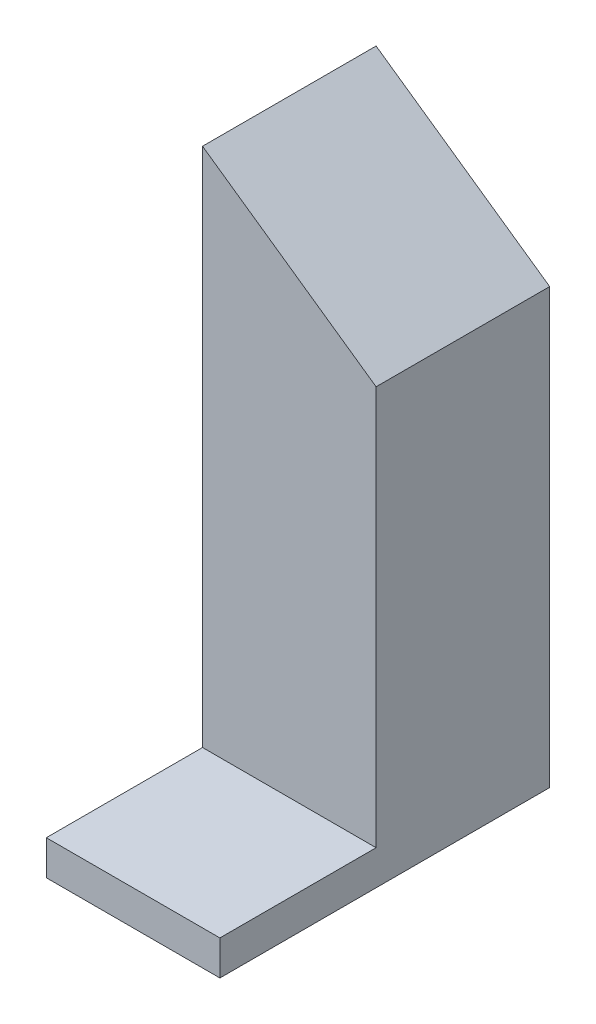
ISO-10303-21;
HEADER;
FILE_DESCRIPTION(('STEP AP214'),'2;1');
FILE_NAME('part.step','',(''),(''),'','','');
FILE_SCHEMA(('AUTOMOTIVE_DESIGN { 1 0 10303 214 1 1 1 1 }'));
ENDSEC;
DATA;
#1=APPLICATION_CONTEXT('core data for automotive mechanical design processes');
#2=APPLICATION_PROTOCOL_DEFINITION('international standard','automotive_design',2000,#1);
#3=PRODUCT_CONTEXT('',#1,'mechanical');
#4=PRODUCT('Part','Part','',(#3));
#5=PRODUCT_RELATED_PRODUCT_CATEGORY('part','',(#4));
#6=PRODUCT_DEFINITION_FORMATION('','',#4);
#7=PRODUCT_DEFINITION_CONTEXT('part definition',#1,'design');
#8=PRODUCT_DEFINITION('design','',#6,#7);
#9=PRODUCT_DEFINITION_SHAPE('','',#8);
#10=(LENGTH_UNIT() NAMED_UNIT(*) SI_UNIT(.MILLI.,.METRE.));
#11=(NAMED_UNIT(*) PLANE_ANGLE_UNIT() SI_UNIT($,.RADIAN.));
#12=(NAMED_UNIT(*) SI_UNIT($,.STERADIAN.) SOLID_ANGLE_UNIT());
#13=UNCERTAINTY_MEASURE_WITH_UNIT(LENGTH_MEASURE(1.E-05),#10,'distance_accuracy_value','');
#14=(GEOMETRIC_REPRESENTATION_CONTEXT(3) GLOBAL_UNCERTAINTY_ASSIGNED_CONTEXT((#13)) GLOBAL_UNIT_ASSIGNED_CONTEXT((#10,
#11,#12)) REPRESENTATION_CONTEXT('',''));
#15=CARTESIAN_POINT('',(0.,0.,0.));
#16=DIRECTION('',(0.,0.,1.));
#17=DIRECTION('',(1.,0.,0.));
#18=AXIS2_PLACEMENT_3D('',#15,#16,#17);
#19=CARTESIAN_POINT('',(5.,1.49896230895141,5.));
#20=DIRECTION('',(-1.,0.,0.));
#21=DIRECTION('',(0.,0.,1.));
#22=AXIS2_PLACEMENT_3D('',#19,#20,#21);
#23=PLANE('',#22);
#24=DIRECTION('',(0.,1.,0.));
#25=VECTOR('',#24,1.);
#26=CARTESIAN_POINT('',(5.,1.49896230895141,0.));
#27=LINE('',#26,#25);
#28=CARTESIAN_POINT('',(5.,-11.,0.));
#29=VERTEX_POINT('',#28);
#30=CARTESIAN_POINT('',(5.,1.49896230895141,0.));
#31=VERTEX_POINT('',#30);
#32=EDGE_CURVE('E62',#29,#31,#27,.T.);
#33=ORIENTED_EDGE('',*,*,#32,.T.);
#34=DIRECTION('',(0.,0.,-1.));
#35=VECTOR('',#34,1.);
#36=CARTESIAN_POINT('',(5.,1.49896230895141,5.));
#37=LINE('',#36,#35);
#38=CARTESIAN_POINT('',(5.,1.49896230895141,5.));
#39=VERTEX_POINT('',#38);
#40=EDGE_CURVE('E11',#39,#31,#37,.T.);
#41=ORIENTED_EDGE('',*,*,#40,.F.);
#42=DIRECTION('',(0.,1.,0.));
#43=VECTOR('',#42,1.);
#44=CARTESIAN_POINT('',(5.,1.49896230895141,5.));
#45=LINE('',#44,#43);
#46=CARTESIAN_POINT('',(5.,-10.,5.));
#47=VERTEX_POINT('',#46);
#48=EDGE_CURVE('E92',#47,#39,#45,.T.);
#49=ORIENTED_EDGE('',*,*,#48,.F.);
#50=DIRECTION('',(0.,0.,1.));
#51=VECTOR('',#50,1.);
#52=CARTESIAN_POINT('',(5.,-10.,0.));
#53=LINE('',#52,#51);
#54=CARTESIAN_POINT('',(5.,-10.,9.5));
#55=VERTEX_POINT('',#54);
#56=EDGE_CURVE('E80',#47,#55,#53,.T.);
#57=ORIENTED_EDGE('',*,*,#56,.T.);
#58=DIRECTION('',(0.,1.,0.));
#59=VECTOR('',#58,1.);
#60=CARTESIAN_POINT('',(5.,-11.,9.5));
#61=LINE('',#60,#59);
#62=CARTESIAN_POINT('',(5.,-11.,9.5));
#63=VERTEX_POINT('',#62);
#64=EDGE_CURVE('E102',#63,#55,#61,.T.);
#65=ORIENTED_EDGE('',*,*,#64,.F.);
#66=DIRECTION('',(0.,0.,1.));
#67=VECTOR('',#66,1.);
#68=CARTESIAN_POINT('',(5.,-11.,0.));
#69=LINE('',#68,#67);
#70=EDGE_CURVE('E123',#29,#63,#69,.T.);
#71=ORIENTED_EDGE('',*,*,#70,.F.);
#72=EDGE_LOOP('',(#33,#41,#49,#57,#65,#71));
#73=FACE_BOUND('',#72,.T.);
#74=ADVANCED_FACE('F33',(#73),#23,.F.);
#75=CARTESIAN_POINT('',(0.,5.,5.));
#76=DIRECTION('',(-0.57357643635105,-0.819152044288989,0.));
#77=DIRECTION('',(0.819152044288989,-0.57357643635105,0.));
#78=AXIS2_PLACEMENT_3D('',#75,#76,#77);
#79=PLANE('',#78);
#80=DIRECTION('',(-0.819152044288989,0.57357643635105,0.));
#81=VECTOR('',#80,1.);
#82=CARTESIAN_POINT('',(0.,5.,0.));
#83=LINE('',#82,#81);
#84=CARTESIAN_POINT('',(0.,5.,0.));
#85=VERTEX_POINT('',#84);
#86=EDGE_CURVE('E101',#31,#85,#83,.T.);
#87=ORIENTED_EDGE('',*,*,#86,.T.);
#88=DIRECTION('',(0.,0.,-1.));
#89=VECTOR('',#88,1.);
#90=CARTESIAN_POINT('',(0.,5.,5.));
#91=LINE('',#90,#89);
#92=CARTESIAN_POINT('',(0.,5.,5.));
#93=VERTEX_POINT('',#92);
#94=EDGE_CURVE('E41',#93,#85,#91,.T.);
#95=ORIENTED_EDGE('',*,*,#94,.F.);
#96=DIRECTION('',(-0.819152044288989,0.57357643635105,0.));
#97=VECTOR('',#96,1.);
#98=CARTESIAN_POINT('',(0.,5.,5.));
#99=LINE('',#98,#97);
#100=EDGE_CURVE('E95',#39,#93,#99,.T.);
#101=ORIENTED_EDGE('',*,*,#100,.F.);
#102=ORIENTED_EDGE('',*,*,#40,.T.);
#103=EDGE_LOOP('',(#87,#95,#101,#102));
#104=FACE_BOUND('',#103,.T.);
#105=ADVANCED_FACE('F153',(#104),#79,.F.);
#106=CARTESIAN_POINT('',(0.,0.,5.));
#107=DIRECTION('',(1.,0.,0.));
#108=DIRECTION('',(0.,0.,-1.));
#109=AXIS2_PLACEMENT_3D('',#106,#107,#108);
#110=PLANE('',#109);
#111=DIRECTION('',(0.,-1.,0.));
#112=VECTOR('',#111,1.);
#113=CARTESIAN_POINT('',(0.,0.,0.));
#114=LINE('',#113,#112);
#115=CARTESIAN_POINT('',(0.,-11.,0.));
#116=VERTEX_POINT('',#115);
#117=EDGE_CURVE('E104',#85,#116,#114,.T.);
#118=ORIENTED_EDGE('',*,*,#117,.T.);
#119=DIRECTION('',(0.,0.,-1.));
#120=VECTOR('',#119,1.);
#121=CARTESIAN_POINT('',(0.,-11.,0.));
#122=LINE('',#121,#120);
#123=CARTESIAN_POINT('',(0.,-11.,9.5));
#124=VERTEX_POINT('',#123);
#125=EDGE_CURVE('E124',#124,#116,#122,.T.);
#126=ORIENTED_EDGE('',*,*,#125,.F.);
#127=DIRECTION('',(0.,1.,0.));
#128=VECTOR('',#127,1.);
#129=CARTESIAN_POINT('',(0.,-11.,9.5));
#130=LINE('',#129,#128);
#131=CARTESIAN_POINT('',(0.,-10.,9.5));
#132=VERTEX_POINT('',#131);
#133=EDGE_CURVE('E136',#124,#132,#130,.T.);
#134=ORIENTED_EDGE('',*,*,#133,.T.);
#135=DIRECTION('',(0.,0.,-1.));
#136=VECTOR('',#135,1.);
#137=CARTESIAN_POINT('',(0.,-10.,0.));
#138=LINE('',#137,#136);
#139=CARTESIAN_POINT('',(0.,-10.,5.));
#140=VERTEX_POINT('',#139);
#141=EDGE_CURVE('E88',#132,#140,#138,.T.);
#142=ORIENTED_EDGE('',*,*,#141,.T.);
#143=DIRECTION('',(0.,-1.,0.));
#144=VECTOR('',#143,1.);
#145=CARTESIAN_POINT('',(0.,0.,5.));
#146=LINE('',#145,#144);
#147=EDGE_CURVE('E49',#93,#140,#146,.T.);
#148=ORIENTED_EDGE('',*,*,#147,.F.);
#149=ORIENTED_EDGE('',*,*,#94,.T.);
#150=EDGE_LOOP('',(#118,#126,#134,#142,#148,#149));
#151=FACE_BOUND('',#150,.T.);
#152=ADVANCED_FACE('F108',(#151),#110,.F.);
#153=CARTESIAN_POINT('',(0.,0.,5.));
#154=DIRECTION('',(0.,0.,1.));
#155=DIRECTION('',(1.,0.,0.));
#156=AXIS2_PLACEMENT_3D('',#153,#154,#155);
#157=PLANE('',#156);
#158=ORIENTED_EDGE('',*,*,#147,.T.);
#159=DIRECTION('',(1.,0.,0.));
#160=VECTOR('',#159,1.);
#161=CARTESIAN_POINT('',(0.,-10.,5.));
#162=LINE('',#161,#160);
#163=EDGE_CURVE('E71',#140,#47,#162,.T.);
#164=ORIENTED_EDGE('',*,*,#163,.T.);
#165=ORIENTED_EDGE('',*,*,#48,.T.);
#166=ORIENTED_EDGE('',*,*,#100,.T.);
#167=EDGE_LOOP('',(#158,#164,#165,#166));
#168=FACE_BOUND('',#167,.T.);
#169=ADVANCED_FACE('F91',(#168),#157,.T.);
#170=CARTESIAN_POINT('',(0.,0.,0.));
#171=DIRECTION('',(0.,0.,1.));
#172=DIRECTION('',(1.,0.,0.));
#173=AXIS2_PLACEMENT_3D('',#170,#171,#172);
#174=PLANE('',#173);
#175=ORIENTED_EDGE('',*,*,#32,.F.);
#176=DIRECTION('',(1.,0.,0.));
#177=VECTOR('',#176,1.);
#178=CARTESIAN_POINT('',(0.,-11.,0.));
#179=LINE('',#178,#177);
#180=EDGE_CURVE('E117',#116,#29,#179,.T.);
#181=ORIENTED_EDGE('',*,*,#180,.F.);
#182=ORIENTED_EDGE('',*,*,#117,.F.);
#183=ORIENTED_EDGE('',*,*,#86,.F.);
#184=EDGE_LOOP('',(#175,#181,#182,#183));
#185=FACE_BOUND('',#184,.T.);
#186=ADVANCED_FACE('F115',(#185),#174,.F.);
#187=CARTESIAN_POINT('',(0.,-10.,0.));
#188=DIRECTION('',(0.,1.,0.));
#189=DIRECTION('',(0.,0.,1.));
#190=AXIS2_PLACEMENT_3D('',#187,#188,#189);
#191=PLANE('',#190);
#192=ORIENTED_EDGE('',*,*,#163,.F.);
#193=ORIENTED_EDGE('',*,*,#141,.F.);
#194=DIRECTION('',(-1.,0.,0.));
#195=VECTOR('',#194,1.);
#196=CARTESIAN_POINT('',(0.,-10.,9.5));
#197=LINE('',#196,#195);
#198=EDGE_CURVE('E84',#55,#132,#197,.T.);
#199=ORIENTED_EDGE('',*,*,#198,.F.);
#200=ORIENTED_EDGE('',*,*,#56,.F.);
#201=EDGE_LOOP('',(#192,#193,#199,#200));
#202=FACE_BOUND('',#201,.T.);
#203=ADVANCED_FACE('F81',(#202),#191,.T.);
#204=CARTESIAN_POINT('',(0.,-11.,9.5));
#205=DIRECTION('',(0.,0.,-1.));
#206=DIRECTION('',(-1.,0.,0.));
#207=AXIS2_PLACEMENT_3D('',#204,#205,#206);
#208=PLANE('',#207);
#209=ORIENTED_EDGE('',*,*,#198,.T.);
#210=ORIENTED_EDGE('',*,*,#133,.F.);
#211=DIRECTION('',(-1.,0.,0.));
#212=VECTOR('',#211,1.);
#213=CARTESIAN_POINT('',(0.,-11.,9.5));
#214=LINE('',#213,#212);
#215=EDGE_CURVE('E128',#63,#124,#214,.T.);
#216=ORIENTED_EDGE('',*,*,#215,.F.);
#217=ORIENTED_EDGE('',*,*,#64,.T.);
#218=EDGE_LOOP('',(#209,#210,#216,#217));
#219=FACE_BOUND('',#218,.T.);
#220=ADVANCED_FACE('F140',(#219),#208,.F.);
#221=CARTESIAN_POINT('',(0.,-11.,0.));
#222=DIRECTION('',(0.,1.,0.));
#223=DIRECTION('',(0.,0.,1.));
#224=AXIS2_PLACEMENT_3D('',#221,#222,#223);
#225=PLANE('',#224);
#226=ORIENTED_EDGE('',*,*,#125,.T.);
#227=ORIENTED_EDGE('',*,*,#180,.T.);
#228=ORIENTED_EDGE('',*,*,#70,.T.);
#229=ORIENTED_EDGE('',*,*,#215,.T.);
#230=EDGE_LOOP('',(#226,#227,#228,#229));
#231=FACE_BOUND('',#230,.T.);
#232=ADVANCED_FACE('F126',(#231),#225,.F.);
#233=CLOSED_SHELL('',(#74,#105,#152,#169,#186,#203,#220,#232));
#234=MANIFOLD_SOLID_BREP('B2',#233);
#235=ADVANCED_BREP_SHAPE_REPRESENTATION('',(#18,#234),#14);
#236=SHAPE_DEFINITION_REPRESENTATION(#9,#235);
ENDSEC;
END-ISO-10303-21;
